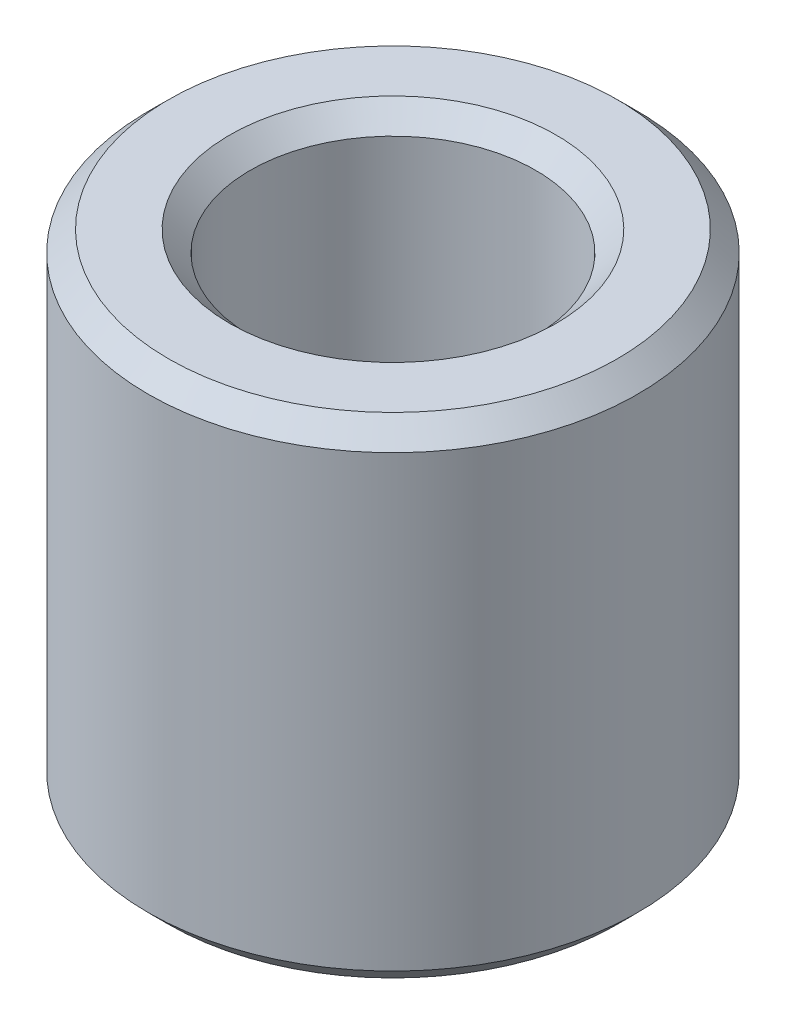
ISO-10303-21;
HEADER;
FILE_DESCRIPTION(('STEP AP214'),'2;1');
FILE_NAME('part.step','',(''),(''),'','','');
FILE_SCHEMA(('AUTOMOTIVE_DESIGN { 1 0 10303 214 1 1 1 1 }'));
ENDSEC;
DATA;
#1=APPLICATION_CONTEXT('core data for automotive mechanical design processes');
#2=APPLICATION_PROTOCOL_DEFINITION('international standard','automotive_design',2000,#1);
#3=PRODUCT_CONTEXT('',#1,'mechanical');
#4=PRODUCT('Part','Part','',(#3));
#5=PRODUCT_RELATED_PRODUCT_CATEGORY('part','',(#4));
#6=PRODUCT_DEFINITION_FORMATION('','',#4);
#7=PRODUCT_DEFINITION_CONTEXT('part definition',#1,'design');
#8=PRODUCT_DEFINITION('design','',#6,#7);
#9=PRODUCT_DEFINITION_SHAPE('','',#8);
#10=(LENGTH_UNIT() NAMED_UNIT(*) SI_UNIT(.MILLI.,.METRE.));
#11=(NAMED_UNIT(*) PLANE_ANGLE_UNIT() SI_UNIT($,.RADIAN.));
#12=(NAMED_UNIT(*) SI_UNIT($,.STERADIAN.) SOLID_ANGLE_UNIT());
#13=UNCERTAINTY_MEASURE_WITH_UNIT(LENGTH_MEASURE(1.E-05),#10,'distance_accuracy_value','');
#14=(GEOMETRIC_REPRESENTATION_CONTEXT(3) GLOBAL_UNCERTAINTY_ASSIGNED_CONTEXT((#13)) GLOBAL_UNIT_ASSIGNED_CONTEXT((#10,
#11,#12)) REPRESENTATION_CONTEXT('',''));
#15=CARTESIAN_POINT('',(0.,0.,0.));
#16=DIRECTION('',(0.,0.,1.));
#17=DIRECTION('',(1.,0.,0.));
#18=AXIS2_PLACEMENT_3D('',#15,#16,#17);
#19=CARTESIAN_POINT('',(0.,6.,0.));
#20=DIRECTION('',(0.,1.,0.));
#21=DIRECTION('',(0.,0.,1.));
#22=AXIS2_PLACEMENT_3D('',#19,#20,#21);
#23=PLANE('',#22);
#24=CARTESIAN_POINT('',(0.,6.,0.));
#25=DIRECTION('',(0.,1.,0.));
#26=DIRECTION('',(0.,0.,1.));
#27=AXIS2_PLACEMENT_3D('',#24,#25,#26);
#28=CIRCLE('',#27,2.);
#29=CARTESIAN_POINT('',(0.,6.,2.));
#30=VERTEX_POINT('',#29);
#31=EDGE_CURVE('E51',#30,#30,#28,.F.);
#32=ORIENTED_EDGE('',*,*,#31,.T.);
#33=EDGE_LOOP('',(#32));
#34=FACE_BOUND('',#33,.T.);
#35=CARTESIAN_POINT('',(0.,6.,0.));
#36=DIRECTION('',(0.,1.,0.));
#37=DIRECTION('',(0.,0.,1.));
#38=AXIS2_PLACEMENT_3D('',#35,#36,#37);
#39=CIRCLE('',#38,2.75);
#40=CARTESIAN_POINT('',(0.,6.,2.75));
#41=VERTEX_POINT('',#40);
#42=EDGE_CURVE('E54',#41,#41,#39,.T.);
#43=ORIENTED_EDGE('',*,*,#42,.T.);
#44=EDGE_LOOP('',(#43));
#45=FACE_BOUND('',#44,.T.);
#46=ADVANCED_FACE('F31',(#34,#45),#23,.T.);
#47=CARTESIAN_POINT('',(0.,0.,0.));
#48=DIRECTION('',(0.,1.,0.));
#49=DIRECTION('',(0.,0.,1.));
#50=AXIS2_PLACEMENT_3D('',#47,#48,#49);
#51=PLANE('',#50);
#52=CARTESIAN_POINT('',(0.,0.,0.));
#53=DIRECTION('',(0.,1.,0.));
#54=DIRECTION('',(0.,0.,1.));
#55=AXIS2_PLACEMENT_3D('',#52,#53,#54);
#56=CIRCLE('',#55,2.);
#57=CARTESIAN_POINT('',(0.,0.,2.));
#58=VERTEX_POINT('',#57);
#59=EDGE_CURVE('E42',#58,#58,#56,.T.);
#60=ORIENTED_EDGE('',*,*,#59,.T.);
#61=EDGE_LOOP('',(#60));
#62=FACE_BOUND('',#61,.T.);
#63=CARTESIAN_POINT('',(0.,0.,0.));
#64=DIRECTION('',(0.,1.,0.));
#65=DIRECTION('',(0.,0.,1.));
#66=AXIS2_PLACEMENT_3D('',#63,#64,#65);
#67=CIRCLE('',#66,2.75);
#68=CARTESIAN_POINT('',(0.,0.,2.75));
#69=VERTEX_POINT('',#68);
#70=EDGE_CURVE('E46',#69,#69,#67,.F.);
#71=ORIENTED_EDGE('',*,*,#70,.T.);
#72=EDGE_LOOP('',(#71));
#73=FACE_BOUND('',#72,.T.);
#74=ADVANCED_FACE('F74',(#62,#73),#51,.F.);
#75=CARTESIAN_POINT('',(0.,6.,0.));
#76=DIRECTION('',(0.,-1.,0.));
#77=DIRECTION('',(0.,0.,-1.));
#78=AXIS2_PLACEMENT_3D('',#75,#76,#77);
#79=CYLINDRICAL_SURFACE('',#78,3.);
#80=CARTESIAN_POINT('',(0.,0.25,0.));
#81=DIRECTION('',(0.,1.,0.));
#82=DIRECTION('',(0.,0.,1.));
#83=AXIS2_PLACEMENT_3D('',#80,#81,#82);
#84=CIRCLE('',#83,3.);
#85=CARTESIAN_POINT('',(0.,0.25,3.));
#86=VERTEX_POINT('',#85);
#87=EDGE_CURVE('E10',#86,#86,#84,.T.);
#88=ORIENTED_EDGE('',*,*,#87,.T.);
#89=EDGE_LOOP('',(#88));
#90=FACE_BOUND('',#89,.T.);
#91=CARTESIAN_POINT('',(0.,5.75,0.));
#92=DIRECTION('',(0.,1.,0.));
#93=DIRECTION('',(0.,0.,1.));
#94=AXIS2_PLACEMENT_3D('',#91,#92,#93);
#95=CIRCLE('',#94,3.);
#96=CARTESIAN_POINT('',(0.,5.75,3.));
#97=VERTEX_POINT('',#96);
#98=EDGE_CURVE('E38',#97,#97,#95,.F.);
#99=ORIENTED_EDGE('',*,*,#98,.T.);
#100=EDGE_LOOP('',(#99));
#101=FACE_BOUND('',#100,.T.);
#102=ADVANCED_FACE('F77',(#90,#101),#79,.T.);
#103=CARTESIAN_POINT('',(0.,6.,0.));
#104=DIRECTION('',(0.,-1.,0.));
#105=DIRECTION('',(0.,0.,-1.));
#106=AXIS2_PLACEMENT_3D('',#103,#104,#105);
#107=CYLINDRICAL_SURFACE('',#106,1.75);
#108=CARTESIAN_POINT('',(0.,5.75,0.));
#109=DIRECTION('',(0.,1.,0.));
#110=DIRECTION('',(0.,0.,1.));
#111=AXIS2_PLACEMENT_3D('',#108,#109,#110);
#112=CIRCLE('',#111,1.75);
#113=CARTESIAN_POINT('',(0.,5.75,1.75));
#114=VERTEX_POINT('',#113);
#115=EDGE_CURVE('E57',#114,#114,#112,.T.);
#116=ORIENTED_EDGE('',*,*,#115,.T.);
#117=EDGE_LOOP('',(#116));
#118=FACE_BOUND('',#117,.T.);
#119=CARTESIAN_POINT('',(0.,0.249999999999999,0.));
#120=DIRECTION('',(0.,1.,0.));
#121=DIRECTION('',(0.,0.,1.));
#122=AXIS2_PLACEMENT_3D('',#119,#120,#121);
#123=CIRCLE('',#122,1.75);
#124=CARTESIAN_POINT('',(0.,0.249999999999999,1.75));
#125=VERTEX_POINT('',#124);
#126=EDGE_CURVE('E60',#125,#125,#123,.F.);
#127=ORIENTED_EDGE('',*,*,#126,.T.);
#128=EDGE_LOOP('',(#127));
#129=FACE_BOUND('',#128,.T.);
#130=ADVANCED_FACE('F64',(#118,#129),#107,.F.);
#131=CARTESIAN_POINT('',(0.,5.75,0.));
#132=DIRECTION('',(0.,1.,0.));
#133=DIRECTION('',(0.,0.,1.));
#134=AXIS2_PLACEMENT_3D('',#131,#132,#133);
#135=CONICAL_SURFACE('',#134,1.75,0.785398163397452);
#136=ORIENTED_EDGE('',*,*,#31,.F.);
#137=EDGE_LOOP('',(#136));
#138=FACE_BOUND('',#137,.T.);
#139=ORIENTED_EDGE('',*,*,#115,.F.);
#140=EDGE_LOOP('',(#139));
#141=FACE_BOUND('',#140,.T.);
#142=ADVANCED_FACE('F70',(#138,#141),#135,.F.);
#143=CARTESIAN_POINT('',(0.,0.,0.));
#144=DIRECTION('',(0.,-1.,0.));
#145=DIRECTION('',(0.,0.,-1.));
#146=AXIS2_PLACEMENT_3D('',#143,#144,#145);
#147=CONICAL_SURFACE('',#146,2.,0.785398163397448);
#148=ORIENTED_EDGE('',*,*,#126,.F.);
#149=EDGE_LOOP('',(#148));
#150=FACE_BOUND('',#149,.T.);
#151=ORIENTED_EDGE('',*,*,#59,.F.);
#152=EDGE_LOOP('',(#151));
#153=FACE_BOUND('',#152,.T.);
#154=ADVANCED_FACE('F66',(#150,#153),#147,.F.);
#155=CARTESIAN_POINT('',(0.,0.25,0.));
#156=DIRECTION('',(0.,1.,0.));
#157=DIRECTION('',(0.,0.,1.));
#158=AXIS2_PLACEMENT_3D('',#155,#156,#157);
#159=CONICAL_SURFACE('',#158,3.,0.78539816339745);
#160=ORIENTED_EDGE('',*,*,#70,.F.);
#161=EDGE_LOOP('',(#160));
#162=FACE_BOUND('',#161,.T.);
#163=ORIENTED_EDGE('',*,*,#87,.F.);
#164=EDGE_LOOP('',(#163));
#165=FACE_BOUND('',#164,.T.);
#166=ADVANCED_FACE('F69',(#162,#165),#159,.T.);
#167=CARTESIAN_POINT('',(0.,6.,0.));
#168=DIRECTION('',(0.,-1.,0.));
#169=DIRECTION('',(0.,0.,-1.));
#170=AXIS2_PLACEMENT_3D('',#167,#168,#169);
#171=CONICAL_SURFACE('',#170,2.75,0.785398163397447);
#172=ORIENTED_EDGE('',*,*,#98,.F.);
#173=EDGE_LOOP('',(#172));
#174=FACE_BOUND('',#173,.T.);
#175=ORIENTED_EDGE('',*,*,#42,.F.);
#176=EDGE_LOOP('',(#175));
#177=FACE_BOUND('',#176,.T.);
#178=ADVANCED_FACE('F33',(#174,#177),#171,.T.);
#179=CLOSED_SHELL('',(#46,#74,#102,#130,#142,#154,#166,#178));
#180=MANIFOLD_SOLID_BREP('B2',#179);
#181=ADVANCED_BREP_SHAPE_REPRESENTATION('',(#18,#180),#14);
#182=SHAPE_DEFINITION_REPRESENTATION(#9,#181);
ENDSEC;
END-ISO-10303-21;
